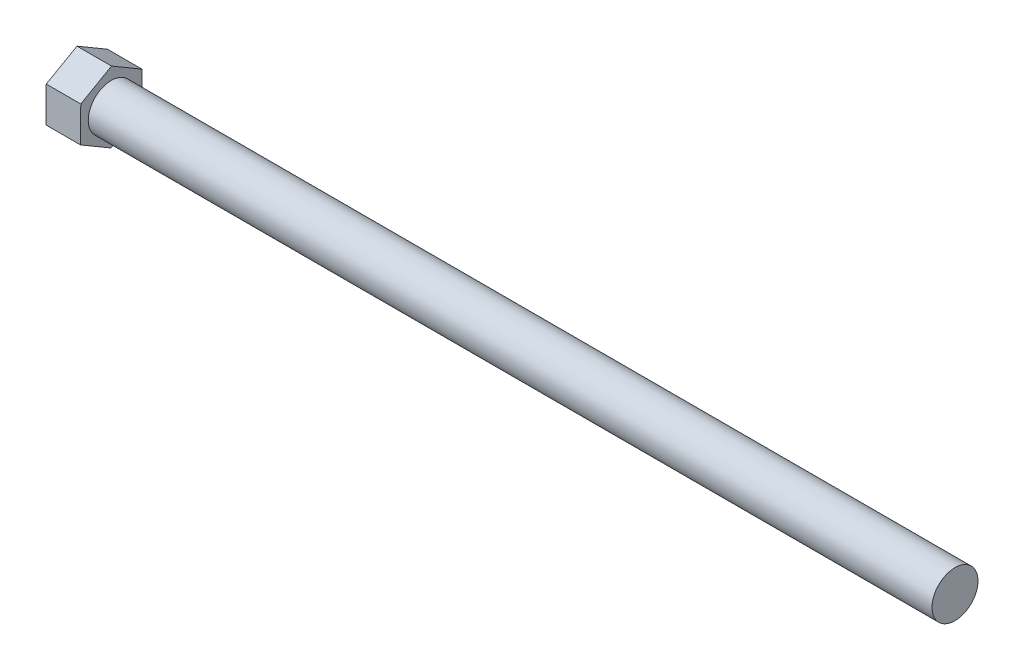
ISO-10303-21;
HEADER;
FILE_DESCRIPTION(('STEP AP214'),'2;1');
FILE_NAME('part.step','',(''),(''),'','','');
FILE_SCHEMA(('AUTOMOTIVE_DESIGN { 1 0 10303 214 1 1 1 1 }'));
ENDSEC;
DATA;
#1=APPLICATION_CONTEXT('core data for automotive mechanical design processes');
#2=APPLICATION_PROTOCOL_DEFINITION('international standard','automotive_design',2000,#1);
#3=PRODUCT_CONTEXT('',#1,'mechanical');
#4=PRODUCT('Part','Part','',(#3));
#5=PRODUCT_RELATED_PRODUCT_CATEGORY('part','',(#4));
#6=PRODUCT_DEFINITION_FORMATION('','',#4);
#7=PRODUCT_DEFINITION_CONTEXT('part definition',#1,'design');
#8=PRODUCT_DEFINITION('design','',#6,#7);
#9=PRODUCT_DEFINITION_SHAPE('','',#8);
#10=(LENGTH_UNIT() NAMED_UNIT(*) SI_UNIT(.MILLI.,.METRE.));
#11=(NAMED_UNIT(*) PLANE_ANGLE_UNIT() SI_UNIT($,.RADIAN.));
#12=(NAMED_UNIT(*) SI_UNIT($,.STERADIAN.) SOLID_ANGLE_UNIT());
#13=UNCERTAINTY_MEASURE_WITH_UNIT(LENGTH_MEASURE(1.E-05),#10,'distance_accuracy_value','');
#14=(GEOMETRIC_REPRESENTATION_CONTEXT(3) GLOBAL_UNCERTAINTY_ASSIGNED_CONTEXT((#13)) GLOBAL_UNIT_ASSIGNED_CONTEXT((#10,
#11,#12)) REPRESENTATION_CONTEXT('',''));
#15=CARTESIAN_POINT('',(0.,0.,0.));
#16=DIRECTION('',(0.,0.,1.));
#17=DIRECTION('',(1.,0.,0.));
#18=AXIS2_PLACEMENT_3D('',#15,#16,#17);
#19=CARTESIAN_POINT('',(220.,0.,0.));
#20=DIRECTION('',(-1.,0.,0.));
#21=DIRECTION('',(0.,0.,1.));
#22=AXIS2_PLACEMENT_3D('',#19,#20,#21);
#23=CYLINDRICAL_SURFACE('',#22,6.);
#24=CARTESIAN_POINT('',(220.,0.,0.));
#25=DIRECTION('',(1.,0.,0.));
#26=DIRECTION('',(0.,0.,-1.));
#27=AXIS2_PLACEMENT_3D('',#24,#25,#26);
#28=CIRCLE('',#27,6.);
#29=CARTESIAN_POINT('',(220.,0.,-6.));
#30=VERTEX_POINT('',#29);
#31=EDGE_CURVE('E13',#30,#30,#28,.T.);
#32=ORIENTED_EDGE('',*,*,#31,.F.);
#33=EDGE_LOOP('',(#32));
#34=FACE_BOUND('',#33,.T.);
#35=CARTESIAN_POINT('',(0.,0.,0.));
#36=DIRECTION('',(-1.,0.,0.));
#37=DIRECTION('',(0.,0.,1.));
#38=AXIS2_PLACEMENT_3D('',#35,#36,#37);
#39=CIRCLE('',#38,6.);
#40=CARTESIAN_POINT('',(0.,0.,6.));
#41=VERTEX_POINT('',#40);
#42=EDGE_CURVE('E54',#41,#41,#39,.T.);
#43=ORIENTED_EDGE('',*,*,#42,.F.);
#44=EDGE_LOOP('',(#43));
#45=FACE_BOUND('',#44,.T.);
#46=ADVANCED_FACE('F46',(#34,#45),#23,.T.);
#47=CARTESIAN_POINT('',(220.,0.,0.));
#48=DIRECTION('',(1.,0.,0.));
#49=DIRECTION('',(0.,0.,-1.));
#50=AXIS2_PLACEMENT_3D('',#47,#48,#49);
#51=PLANE('',#50);
#52=ORIENTED_EDGE('',*,*,#31,.T.);
#53=EDGE_LOOP('',(#52));
#54=FACE_BOUND('',#53,.T.);
#55=ADVANCED_FACE('F156',(#54),#51,.T.);
#56=CARTESIAN_POINT('',(-9.,-9.21617473360475,0.0658552515078181));
#57=DIRECTION('',(0.,0.862430577964464,-0.506175363082678));
#58=DIRECTION('',(0.,0.506175363082678,0.862430577964464));
#59=AXIS2_PLACEMENT_3D('',#56,#57,#58);
#60=PLANE('',#59);
#61=DIRECTION('',(0.,0.506175363082678,0.862430577964464));
#62=VECTOR('',#61,1.);
#63=CARTESIAN_POINT('',(0.,-9.21617473360475,0.0658552515078181));
#64=LINE('',#63,#62);
#65=CARTESIAN_POINT('',(0.,-9.21617473360475,0.0658552515078181));
#66=VERTEX_POINT('',#65);
#67=CARTESIAN_POINT('',(0.,-4.55105504602398,8.01436907077191));
#68=VERTEX_POINT('',#67);
#69=EDGE_CURVE('E131',#66,#68,#64,.T.);
#70=ORIENTED_EDGE('',*,*,#69,.T.);
#71=DIRECTION('',(1.,0.,0.));
#72=VECTOR('',#71,1.);
#73=CARTESIAN_POINT('',(-9.,-4.55105504602398,8.01436907077191));
#74=LINE('',#73,#72);
#75=CARTESIAN_POINT('',(-9.,-4.55105504602398,8.01436907077191));
#76=VERTEX_POINT('',#75);
#77=EDGE_CURVE('E148',#76,#68,#74,.T.);
#78=ORIENTED_EDGE('',*,*,#77,.F.);
#79=DIRECTION('',(0.,0.506175363082678,0.862430577964464));
#80=VECTOR('',#79,1.);
#81=CARTESIAN_POINT('',(-9.,-9.21617473360475,0.0658552515078181));
#82=LINE('',#81,#80);
#83=CARTESIAN_POINT('',(-9.,-9.21617473360475,0.0658552515078181));
#84=VERTEX_POINT('',#83);
#85=EDGE_CURVE('E141',#84,#76,#82,.T.);
#86=ORIENTED_EDGE('',*,*,#85,.F.);
#87=DIRECTION('',(1.,0.,0.));
#88=VECTOR('',#87,1.);
#89=CARTESIAN_POINT('',(-9.,-9.21617473360475,0.0658552515078181));
#90=LINE('',#89,#88);
#91=EDGE_CURVE('E127',#84,#66,#90,.T.);
#92=ORIENTED_EDGE('',*,*,#91,.T.);
#93=EDGE_LOOP('',(#70,#78,#86,#92));
#94=FACE_BOUND('',#93,.T.);
#95=ADVANCED_FACE('F161',(#94),#60,.F.);
#96=CARTESIAN_POINT('',(-9.,-4.55105504602398,8.01436907077191));
#97=DIRECTION('',(0.,-0.00714543421717887,-0.999974471059061));
#98=DIRECTION('',(0.,0.999974471059061,-0.00714543421717887));
#99=AXIS2_PLACEMENT_3D('',#96,#97,#98);
#100=PLANE('',#99);
#101=DIRECTION('',(0.,0.999974471059061,-0.00714543421717887));
#102=VECTOR('',#101,1.);
#103=CARTESIAN_POINT('',(0.,-4.55105504602398,8.01436907077191));
#104=LINE('',#103,#102);
#105=CARTESIAN_POINT('',(0.,4.66511968758077,7.94851381926408));
#106=VERTEX_POINT('',#105);
#107=EDGE_CURVE('E134',#68,#106,#104,.T.);
#108=ORIENTED_EDGE('',*,*,#107,.T.);
#109=DIRECTION('',(1.,0.,0.));
#110=VECTOR('',#109,1.);
#111=CARTESIAN_POINT('',(-9.,4.66511968758077,7.94851381926408));
#112=LINE('',#111,#110);
#113=CARTESIAN_POINT('',(-9.,4.66511968758077,7.94851381926408));
#114=VERTEX_POINT('',#113);
#115=EDGE_CURVE('E145',#114,#106,#112,.T.);
#116=ORIENTED_EDGE('',*,*,#115,.F.);
#117=DIRECTION('',(0.,0.999974471059061,-0.00714543421717887));
#118=VECTOR('',#117,1.);
#119=CARTESIAN_POINT('',(-9.,-4.55105504602398,8.01436907077191));
#120=LINE('',#119,#118);
#121=EDGE_CURVE('E100',#76,#114,#120,.T.);
#122=ORIENTED_EDGE('',*,*,#121,.F.);
#123=ORIENTED_EDGE('',*,*,#77,.T.);
#124=EDGE_LOOP('',(#108,#116,#122,#123));
#125=FACE_BOUND('',#124,.T.);
#126=ADVANCED_FACE('F167',(#125),#100,.F.);
#127=CARTESIAN_POINT('',(-9.,4.66511968758077,7.94851381926408));
#128=DIRECTION('',(0.,-0.869576012181643,-0.493799107976383));
#129=DIRECTION('',(0.,0.493799107976383,-0.869576012181643));
#130=AXIS2_PLACEMENT_3D('',#127,#128,#129);
#131=PLANE('',#130);
#132=DIRECTION('',(0.,0.493799107976383,-0.869576012181643));
#133=VECTOR('',#132,1.);
#134=CARTESIAN_POINT('',(0.,4.66511968758077,7.94851381926408));
#135=LINE('',#134,#133);
#136=CARTESIAN_POINT('',(0.,9.21617473360475,-0.0658552515078216));
#137=VERTEX_POINT('',#136);
#138=EDGE_CURVE('E136',#106,#137,#135,.T.);
#139=ORIENTED_EDGE('',*,*,#138,.T.);
#140=DIRECTION('',(1.,0.,0.));
#141=VECTOR('',#140,1.);
#142=CARTESIAN_POINT('',(-9.,9.21617473360475,-0.0658552515078216));
#143=LINE('',#142,#141);
#144=CARTESIAN_POINT('',(-9.,9.21617473360475,-0.0658552515078216));
#145=VERTEX_POINT('',#144);
#146=EDGE_CURVE('E122',#145,#137,#143,.T.);
#147=ORIENTED_EDGE('',*,*,#146,.F.);
#148=DIRECTION('',(0.,0.493799107976383,-0.869576012181643));
#149=VECTOR('',#148,1.);
#150=CARTESIAN_POINT('',(-9.,4.66511968758077,7.94851381926408));
#151=LINE('',#150,#149);
#152=EDGE_CURVE('E113',#114,#145,#151,.T.);
#153=ORIENTED_EDGE('',*,*,#152,.F.);
#154=ORIENTED_EDGE('',*,*,#115,.T.);
#155=EDGE_LOOP('',(#139,#147,#153,#154));
#156=FACE_BOUND('',#155,.T.);
#157=ADVANCED_FACE('F173',(#156),#131,.F.);
#158=CARTESIAN_POINT('',(-9.,9.21617473360475,-0.0658552515078216));
#159=DIRECTION('',(0.,-0.862430577964464,0.506175363082678));
#160=DIRECTION('',(0.,-0.506175363082678,-0.862430577964464));
#161=AXIS2_PLACEMENT_3D('',#158,#159,#160);
#162=PLANE('',#161);
#163=DIRECTION('',(0.,-0.506175363082678,-0.862430577964464));
#164=VECTOR('',#163,1.);
#165=CARTESIAN_POINT('',(0.,9.21617473360475,-0.0658552515078216));
#166=LINE('',#165,#164);
#167=CARTESIAN_POINT('',(0.,4.55105504602399,-8.01436907077191));
#168=VERTEX_POINT('',#167);
#169=EDGE_CURVE('E121',#137,#168,#166,.T.);
#170=ORIENTED_EDGE('',*,*,#169,.T.);
#171=DIRECTION('',(1.,0.,0.));
#172=VECTOR('',#171,1.);
#173=CARTESIAN_POINT('',(-9.,4.55105504602399,-8.01436907077191));
#174=LINE('',#173,#172);
#175=CARTESIAN_POINT('',(-9.,4.55105504602399,-8.01436907077191));
#176=VERTEX_POINT('',#175);
#177=EDGE_CURVE('E118',#176,#168,#174,.T.);
#178=ORIENTED_EDGE('',*,*,#177,.F.);
#179=DIRECTION('',(0.,-0.506175363082678,-0.862430577964464));
#180=VECTOR('',#179,1.);
#181=CARTESIAN_POINT('',(-9.,9.21617473360475,-0.0658552515078216));
#182=LINE('',#181,#180);
#183=EDGE_CURVE('E107',#145,#176,#182,.T.);
#184=ORIENTED_EDGE('',*,*,#183,.F.);
#185=ORIENTED_EDGE('',*,*,#146,.T.);
#186=EDGE_LOOP('',(#170,#178,#184,#185));
#187=FACE_BOUND('',#186,.T.);
#188=ADVANCED_FACE('F119',(#187),#162,.F.);
#189=CARTESIAN_POINT('',(-9.,4.55105504602399,-8.01436907077191));
#190=DIRECTION('',(0.,0.0071454342171785,0.999974471059061));
#191=DIRECTION('',(0.,-0.999974471059061,0.0071454342171785));
#192=AXIS2_PLACEMENT_3D('',#189,#190,#191);
#193=PLANE('',#192);
#194=DIRECTION('',(0.,-0.99997447105906,0.0071454342171785));
#195=VECTOR('',#194,1.);
#196=CARTESIAN_POINT('',(0.,4.55105504602399,-8.01436907077191));
#197=LINE('',#196,#195);
#198=CARTESIAN_POINT('',(0.,-4.66511968758076,-7.94851381926408));
#199=VERTEX_POINT('',#198);
#200=EDGE_CURVE('E85',#168,#199,#197,.T.);
#201=ORIENTED_EDGE('',*,*,#200,.T.);
#202=DIRECTION('',(1.,0.,0.));
#203=VECTOR('',#202,1.);
#204=CARTESIAN_POINT('',(-9.,-4.66511968758076,-7.94851381926408));
#205=LINE('',#204,#203);
#206=CARTESIAN_POINT('',(-9.,-4.66511968758076,-7.94851381926408));
#207=VERTEX_POINT('',#206);
#208=EDGE_CURVE('E123',#207,#199,#205,.T.);
#209=ORIENTED_EDGE('',*,*,#208,.F.);
#210=DIRECTION('',(0.,-0.99997447105906,0.0071454342171785));
#211=VECTOR('',#210,1.);
#212=CARTESIAN_POINT('',(-9.,4.55105504602399,-8.01436907077191));
#213=LINE('',#212,#211);
#214=EDGE_CURVE('E111',#176,#207,#213,.T.);
#215=ORIENTED_EDGE('',*,*,#214,.F.);
#216=ORIENTED_EDGE('',*,*,#177,.T.);
#217=EDGE_LOOP('',(#201,#209,#215,#216));
#218=FACE_BOUND('',#217,.T.);
#219=ADVANCED_FACE('F125',(#218),#193,.F.);
#220=CARTESIAN_POINT('',(-9.,-4.66511968758076,-7.94851381926408));
#221=DIRECTION('',(0.,0.869576012181642,0.493799107976383));
#222=DIRECTION('',(0.,-0.493799107976383,0.869576012181643));
#223=AXIS2_PLACEMENT_3D('',#220,#221,#222);
#224=PLANE('',#223);
#225=DIRECTION('',(0.,-0.493799107976383,0.869576012181642));
#226=VECTOR('',#225,1.);
#227=CARTESIAN_POINT('',(0.,-4.66511968758076,-7.94851381926408));
#228=LINE('',#227,#226);
#229=EDGE_CURVE('E91',#199,#66,#228,.T.);
#230=ORIENTED_EDGE('',*,*,#229,.T.);
#231=ORIENTED_EDGE('',*,*,#91,.F.);
#232=DIRECTION('',(0.,-0.493799107976383,0.869576012181642));
#233=VECTOR('',#232,1.);
#234=CARTESIAN_POINT('',(-9.,-4.66511968758076,-7.94851381926408));
#235=LINE('',#234,#233);
#236=EDGE_CURVE('E62',#207,#84,#235,.T.);
#237=ORIENTED_EDGE('',*,*,#236,.F.);
#238=ORIENTED_EDGE('',*,*,#208,.T.);
#239=EDGE_LOOP('',(#230,#231,#237,#238));
#240=FACE_BOUND('',#239,.T.);
#241=ADVANCED_FACE('F181',(#240),#224,.F.);
#242=CARTESIAN_POINT('',(-9.,0.,0.));
#243=DIRECTION('',(-1.,0.,0.));
#244=DIRECTION('',(0.,0.,1.));
#245=AXIS2_PLACEMENT_3D('',#242,#243,#244);
#246=PLANE('',#245);
#247=ORIENTED_EDGE('',*,*,#85,.T.);
#248=ORIENTED_EDGE('',*,*,#121,.T.);
#249=ORIENTED_EDGE('',*,*,#152,.T.);
#250=ORIENTED_EDGE('',*,*,#183,.T.);
#251=ORIENTED_EDGE('',*,*,#214,.T.);
#252=ORIENTED_EDGE('',*,*,#236,.T.);
#253=EDGE_LOOP('',(#247,#248,#249,#250,#251,#252));
#254=FACE_BOUND('',#253,.T.);
#255=ADVANCED_FACE('F109',(#254),#246,.T.);
#256=CARTESIAN_POINT('',(0.,0.,0.));
#257=DIRECTION('',(-1.,0.,0.));
#258=DIRECTION('',(0.,0.,1.));
#259=AXIS2_PLACEMENT_3D('',#256,#257,#258);
#260=PLANE('',#259);
#261=ORIENTED_EDGE('',*,*,#42,.T.);
#262=EDGE_LOOP('',(#261));
#263=FACE_BOUND('',#262,.T.);
#264=ORIENTED_EDGE('',*,*,#69,.F.);
#265=ORIENTED_EDGE('',*,*,#229,.F.);
#266=ORIENTED_EDGE('',*,*,#200,.F.);
#267=ORIENTED_EDGE('',*,*,#169,.F.);
#268=ORIENTED_EDGE('',*,*,#138,.F.);
#269=ORIENTED_EDGE('',*,*,#107,.F.);
#270=EDGE_LOOP('',(#264,#265,#266,#267,#268,#269));
#271=FACE_BOUND('',#270,.T.);
#272=ADVANCED_FACE('F152',(#263,#271),#260,.F.);
#273=CLOSED_SHELL('',(#46,#55,#95,#126,#157,#188,#219,#241,#255,#272));
#274=MANIFOLD_SOLID_BREP('B2',#273);
#275=ADVANCED_BREP_SHAPE_REPRESENTATION('',(#18,#274),#14);
#276=SHAPE_DEFINITION_REPRESENTATION(#9,#275);
ENDSEC;
END-ISO-10303-21;
